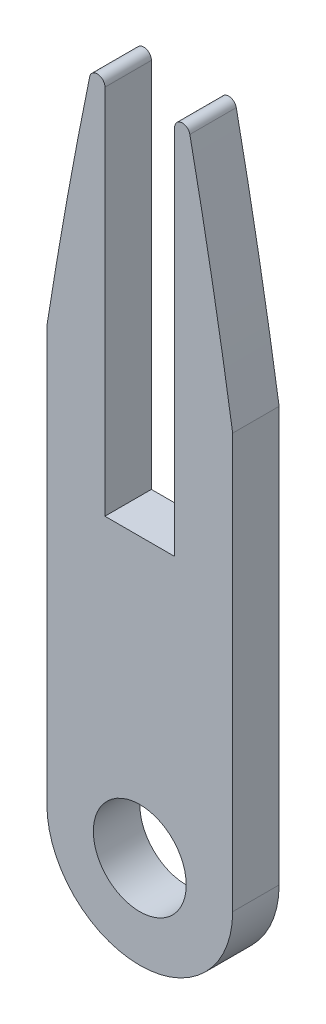
ISO-10303-21;
HEADER;
FILE_DESCRIPTION(('STEP AP214'),'2;1');
FILE_NAME('part.step','',(''),(''),'','','');
FILE_SCHEMA(('AUTOMOTIVE_DESIGN { 1 0 10303 214 1 1 1 1 }'));
ENDSEC;
DATA;
#1=APPLICATION_CONTEXT('core data for automotive mechanical design processes');
#2=APPLICATION_PROTOCOL_DEFINITION('international standard','automotive_design',2000,#1);
#3=PRODUCT_CONTEXT('',#1,'mechanical');
#4=PRODUCT('Part','Part','',(#3));
#5=PRODUCT_RELATED_PRODUCT_CATEGORY('part','',(#4));
#6=PRODUCT_DEFINITION_FORMATION('','',#4);
#7=PRODUCT_DEFINITION_CONTEXT('part definition',#1,'design');
#8=PRODUCT_DEFINITION('design','',#6,#7);
#9=PRODUCT_DEFINITION_SHAPE('','',#8);
#10=(LENGTH_UNIT() NAMED_UNIT(*) SI_UNIT(.MILLI.,.METRE.));
#11=(NAMED_UNIT(*) PLANE_ANGLE_UNIT() SI_UNIT($,.RADIAN.));
#12=(NAMED_UNIT(*) SI_UNIT($,.STERADIAN.) SOLID_ANGLE_UNIT());
#13=UNCERTAINTY_MEASURE_WITH_UNIT(LENGTH_MEASURE(1.E-05),#10,'distance_accuracy_value','');
#14=(GEOMETRIC_REPRESENTATION_CONTEXT(3) GLOBAL_UNCERTAINTY_ASSIGNED_CONTEXT((#13)) GLOBAL_UNIT_ASSIGNED_CONTEXT((#10,
#11,#12)) REPRESENTATION_CONTEXT('',''));
#15=CARTESIAN_POINT('',(0.,0.,0.));
#16=DIRECTION('',(0.,0.,1.));
#17=DIRECTION('',(1.,0.,0.));
#18=AXIS2_PLACEMENT_3D('',#15,#16,#17);
#19=CARTESIAN_POINT('',(-1327.35745312875,-97.269157480229,6.35));
#20=DIRECTION('',(0.,0.,-1.));
#21=DIRECTION('',(-1.,0.,0.));
#22=AXIS2_PLACEMENT_3D('',#19,#20,#21);
#23=CYLINDRICAL_SURFACE('',#22,1369.05400653331);
#24=CARTESIAN_POINT('',(-1327.35745312875,-97.269157480229,-6.35));
#25=DIRECTION('',(0.,0.,1.));
#26=DIRECTION('',(1.,0.,0.));
#27=AXIS2_PLACEMENT_3D('',#24,#25,#26);
#28=CIRCLE('',#27,1369.05400653331);
#29=CARTESIAN_POINT('',(13.6916282188116,178.223554259595,-6.35));
#30=VERTEX_POINT('',#29);
#31=CARTESIAN_POINT('',(25.4,113.339830479728,-6.35));
#32=VERTEX_POINT('',#31);
#33=EDGE_CURVE('E156',#30,#32,#28,.F.);
#34=ORIENTED_EDGE('',*,*,#33,.F.);
#35=DIRECTION('',(0.,0.,-1.));
#36=VECTOR('',#35,1.);
#37=CARTESIAN_POINT('',(13.6916282188116,178.223554259595,6.35));
#38=LINE('',#37,#36);
#39=CARTESIAN_POINT('',(13.6916282188116,178.223554259595,6.35));
#40=VERTEX_POINT('',#39);
#41=EDGE_CURVE('E11',#40,#30,#38,.T.);
#42=ORIENTED_EDGE('',*,*,#41,.F.);
#43=CARTESIAN_POINT('',(-1327.35745312875,-97.269157480229,6.35));
#44=DIRECTION('',(0.,0.,1.));
#45=DIRECTION('',(1.,0.,0.));
#46=AXIS2_PLACEMENT_3D('',#43,#44,#45);
#47=CIRCLE('',#46,1369.05400653331);
#48=CARTESIAN_POINT('',(25.4,113.339830479728,6.35));
#49=VERTEX_POINT('',#48);
#50=EDGE_CURVE('E250',#40,#49,#47,.F.);
#51=ORIENTED_EDGE('',*,*,#50,.T.);
#52=DIRECTION('',(0.,0.,-1.));
#53=VECTOR('',#52,1.);
#54=CARTESIAN_POINT('',(25.4,113.339830479728,6.35));
#55=LINE('',#54,#53);
#56=EDGE_CURVE('E105',#49,#32,#55,.T.);
#57=ORIENTED_EDGE('',*,*,#56,.T.);
#58=EDGE_LOOP('',(#34,#42,#51,#57));
#59=FACE_BOUND('',#58,.T.);
#60=ADVANCED_FACE('F42',(#59),#23,.T.);
#61=CARTESIAN_POINT('',(11.6298420933535,177.8,6.35));
#62=DIRECTION('',(0.,0.,-1.));
#63=DIRECTION('',(-1.,0.,0.));
#64=AXIS2_PLACEMENT_3D('',#61,#62,#63);
#65=CYLINDRICAL_SURFACE('',#64,2.10484209335346);
#66=CARTESIAN_POINT('',(11.6298420933535,177.8,-6.35));
#67=DIRECTION('',(0.,0.,1.));
#68=DIRECTION('',(1.,0.,0.));
#69=AXIS2_PLACEMENT_3D('',#66,#67,#68);
#70=CIRCLE('',#69,2.10484209335346);
#71=CARTESIAN_POINT('',(9.52500000000001,177.8,-6.35));
#72=VERTEX_POINT('',#71);
#73=EDGE_CURVE('E158',#72,#30,#70,.F.);
#74=ORIENTED_EDGE('',*,*,#73,.F.);
#75=DIRECTION('',(0.,0.,-1.));
#76=VECTOR('',#75,1.);
#77=CARTESIAN_POINT('',(9.52500000000001,177.8,6.35));
#78=LINE('',#77,#76);
#79=CARTESIAN_POINT('',(9.52500000000001,177.8,6.35));
#80=VERTEX_POINT('',#79);
#81=EDGE_CURVE('E52',#80,#72,#78,.T.);
#82=ORIENTED_EDGE('',*,*,#81,.F.);
#83=CARTESIAN_POINT('',(11.6298420933535,177.8,6.35));
#84=DIRECTION('',(0.,0.,1.));
#85=DIRECTION('',(1.,0.,0.));
#86=AXIS2_PLACEMENT_3D('',#83,#84,#85);
#87=CIRCLE('',#86,2.10484209335346);
#88=EDGE_CURVE('E202',#80,#40,#87,.F.);
#89=ORIENTED_EDGE('',*,*,#88,.T.);
#90=ORIENTED_EDGE('',*,*,#41,.T.);
#91=EDGE_LOOP('',(#74,#82,#89,#90));
#92=FACE_BOUND('',#91,.T.);
#93=ADVANCED_FACE('F204',(#92),#65,.T.);
#94=CARTESIAN_POINT('',(9.52499999999999,0.,6.35));
#95=DIRECTION('',(1.,0.,0.));
#96=DIRECTION('',(0.,1.,0.));
#97=AXIS2_PLACEMENT_3D('',#94,#95,#96);
#98=PLANE('',#97);
#99=DIRECTION('',(0.,-1.,0.));
#100=VECTOR('',#99,1.);
#101=CARTESIAN_POINT('',(9.52499999999999,0.,-6.35));
#102=LINE('',#101,#100);
#103=CARTESIAN_POINT('',(9.525,76.2,-6.35));
#104=VERTEX_POINT('',#103);
#105=EDGE_CURVE('E161',#72,#104,#102,.T.);
#106=ORIENTED_EDGE('',*,*,#105,.T.);
#107=DIRECTION('',(0.,0.,-1.));
#108=VECTOR('',#107,1.);
#109=CARTESIAN_POINT('',(9.525,76.2,6.35));
#110=LINE('',#109,#108);
#111=CARTESIAN_POINT('',(9.525,76.2,6.35));
#112=VERTEX_POINT('',#111);
#113=EDGE_CURVE('E192',#112,#104,#110,.T.);
#114=ORIENTED_EDGE('',*,*,#113,.F.);
#115=DIRECTION('',(0.,-1.,0.));
#116=VECTOR('',#115,1.);
#117=CARTESIAN_POINT('',(9.52499999999999,0.,6.35));
#118=LINE('',#117,#116);
#119=EDGE_CURVE('E197',#80,#112,#118,.T.);
#120=ORIENTED_EDGE('',*,*,#119,.F.);
#121=ORIENTED_EDGE('',*,*,#81,.T.);
#122=EDGE_LOOP('',(#106,#114,#120,#121));
#123=FACE_BOUND('',#122,.T.);
#124=ADVANCED_FACE('F193',(#123),#98,.F.);
#125=CARTESIAN_POINT('',(0.,76.2,6.35));
#126=DIRECTION('',(0.,1.,0.));
#127=DIRECTION('',(0.,0.,1.));
#128=AXIS2_PLACEMENT_3D('',#125,#126,#127);
#129=PLANE('',#128);
#130=DIRECTION('',(1.,0.,0.));
#131=VECTOR('',#130,1.);
#132=CARTESIAN_POINT('',(0.,76.2,-6.35));
#133=LINE('',#132,#131);
#134=CARTESIAN_POINT('',(-9.525,76.2,-6.35));
#135=VERTEX_POINT('',#134);
#136=EDGE_CURVE('E163',#135,#104,#133,.T.);
#137=ORIENTED_EDGE('',*,*,#136,.F.);
#138=DIRECTION('',(0.,0.,-1.));
#139=VECTOR('',#138,1.);
#140=CARTESIAN_POINT('',(-9.525,76.2,6.35));
#141=LINE('',#140,#139);
#142=CARTESIAN_POINT('',(-9.525,76.2,6.35));
#143=VERTEX_POINT('',#142);
#144=EDGE_CURVE('E186',#143,#135,#141,.T.);
#145=ORIENTED_EDGE('',*,*,#144,.F.);
#146=DIRECTION('',(1.,0.,0.));
#147=VECTOR('',#146,1.);
#148=CARTESIAN_POINT('',(0.,76.2,6.35));
#149=LINE('',#148,#147);
#150=EDGE_CURVE('E255',#143,#112,#149,.T.);
#151=ORIENTED_EDGE('',*,*,#150,.T.);
#152=ORIENTED_EDGE('',*,*,#113,.T.);
#153=EDGE_LOOP('',(#137,#145,#151,#152));
#154=FACE_BOUND('',#153,.T.);
#155=ADVANCED_FACE('F212',(#154),#129,.T.);
#156=CARTESIAN_POINT('',(-9.52499999999999,0.,6.35));
#157=DIRECTION('',(1.,0.,0.));
#158=DIRECTION('',(0.,1.,0.));
#159=AXIS2_PLACEMENT_3D('',#156,#157,#158);
#160=PLANE('',#159);
#161=DIRECTION('',(0.,-1.,0.));
#162=VECTOR('',#161,1.);
#163=CARTESIAN_POINT('',(-9.52499999999999,0.,-6.35));
#164=LINE('',#163,#162);
#165=CARTESIAN_POINT('',(-9.52500000000001,177.8,-6.35));
#166=VERTEX_POINT('',#165);
#167=EDGE_CURVE('E170',#166,#135,#164,.T.);
#168=ORIENTED_EDGE('',*,*,#167,.F.);
#169=DIRECTION('',(0.,0.,-1.));
#170=VECTOR('',#169,1.);
#171=CARTESIAN_POINT('',(-9.52500000000001,177.8,6.35));
#172=LINE('',#171,#170);
#173=CARTESIAN_POINT('',(-9.52500000000001,177.8,6.35));
#174=VERTEX_POINT('',#173);
#175=EDGE_CURVE('E190',#174,#166,#172,.T.);
#176=ORIENTED_EDGE('',*,*,#175,.F.);
#177=DIRECTION('',(0.,-1.,0.));
#178=VECTOR('',#177,1.);
#179=CARTESIAN_POINT('',(-9.52499999999999,0.,6.35));
#180=LINE('',#179,#178);
#181=EDGE_CURVE('E260',#174,#143,#180,.T.);
#182=ORIENTED_EDGE('',*,*,#181,.T.);
#183=ORIENTED_EDGE('',*,*,#144,.T.);
#184=EDGE_LOOP('',(#168,#176,#182,#183));
#185=FACE_BOUND('',#184,.T.);
#186=ADVANCED_FACE('F220',(#185),#160,.T.);
#187=CARTESIAN_POINT('',(-11.6298420933534,177.8,6.35));
#188=DIRECTION('',(0.,0.,-1.));
#189=DIRECTION('',(-1.,0.,0.));
#190=AXIS2_PLACEMENT_3D('',#187,#188,#189);
#191=CYLINDRICAL_SURFACE('',#190,2.10484209335331);
#192=CARTESIAN_POINT('',(-11.6298420933534,177.8,-6.35));
#193=DIRECTION('',(0.,0.,1.));
#194=DIRECTION('',(1.,0.,0.));
#195=AXIS2_PLACEMENT_3D('',#192,#193,#194);
#196=CIRCLE('',#195,2.10484209335331);
#197=CARTESIAN_POINT('',(-13.6916282188115,178.223554259594,-6.35));
#198=VERTEX_POINT('',#197);
#199=EDGE_CURVE('E168',#166,#198,#196,.T.);
#200=ORIENTED_EDGE('',*,*,#199,.T.);
#201=DIRECTION('',(0.,0.,-1.));
#202=VECTOR('',#201,1.);
#203=CARTESIAN_POINT('',(-13.6916282188115,178.223554259594,6.35));
#204=LINE('',#203,#202);
#205=CARTESIAN_POINT('',(-13.6916282188115,178.223554259594,6.35));
#206=VERTEX_POINT('',#205);
#207=EDGE_CURVE('E184',#206,#198,#204,.T.);
#208=ORIENTED_EDGE('',*,*,#207,.F.);
#209=CARTESIAN_POINT('',(-11.6298420933534,177.8,6.35));
#210=DIRECTION('',(0.,0.,1.));
#211=DIRECTION('',(1.,0.,0.));
#212=AXIS2_PLACEMENT_3D('',#209,#210,#211);
#213=CIRCLE('',#212,2.10484209335331);
#214=EDGE_CURVE('E146',#174,#206,#213,.T.);
#215=ORIENTED_EDGE('',*,*,#214,.F.);
#216=ORIENTED_EDGE('',*,*,#175,.T.);
#217=EDGE_LOOP('',(#200,#208,#215,#216));
#218=FACE_BOUND('',#217,.T.);
#219=ADVANCED_FACE('F222',(#218),#191,.T.);
#220=CARTESIAN_POINT('',(1327.35745312875,-97.2691574802253,6.35));
#221=DIRECTION('',(0.,0.,-1.));
#222=DIRECTION('',(-1.,0.,0.));
#223=AXIS2_PLACEMENT_3D('',#220,#221,#222);
#224=CYLINDRICAL_SURFACE('',#223,1369.05400653331);
#225=CARTESIAN_POINT('',(1327.35745312875,-97.2691574802253,-6.35));
#226=DIRECTION('',(0.,0.,1.));
#227=DIRECTION('',(1.,0.,0.));
#228=AXIS2_PLACEMENT_3D('',#225,#226,#227);
#229=CIRCLE('',#228,1369.05400653331);
#230=CARTESIAN_POINT('',(-25.4,113.339830479728,-6.35));
#231=VERTEX_POINT('',#230);
#232=EDGE_CURVE('E174',#198,#231,#229,.T.);
#233=ORIENTED_EDGE('',*,*,#232,.T.);
#234=DIRECTION('',(0.,0.,-1.));
#235=VECTOR('',#234,1.);
#236=CARTESIAN_POINT('',(-25.4,113.339830479728,6.35));
#237=LINE('',#236,#235);
#238=CARTESIAN_POINT('',(-25.4,113.339830479728,6.35));
#239=VERTEX_POINT('',#238);
#240=EDGE_CURVE('E137',#239,#231,#237,.T.);
#241=ORIENTED_EDGE('',*,*,#240,.F.);
#242=CARTESIAN_POINT('',(1327.35745312875,-97.2691574802253,6.35));
#243=DIRECTION('',(0.,0.,1.));
#244=DIRECTION('',(1.,0.,0.));
#245=AXIS2_PLACEMENT_3D('',#242,#243,#244);
#246=CIRCLE('',#245,1369.05400653331);
#247=EDGE_CURVE('E144',#206,#239,#246,.T.);
#248=ORIENTED_EDGE('',*,*,#247,.F.);
#249=ORIENTED_EDGE('',*,*,#207,.T.);
#250=EDGE_LOOP('',(#233,#241,#248,#249));
#251=FACE_BOUND('',#250,.T.);
#252=ADVANCED_FACE('F223',(#251),#224,.T.);
#253=CARTESIAN_POINT('',(-25.4,0.,6.35));
#254=DIRECTION('',(-1.,0.,0.));
#255=DIRECTION('',(0.,-1.,0.));
#256=AXIS2_PLACEMENT_3D('',#253,#254,#255);
#257=PLANE('',#256);
#258=DIRECTION('',(0.,1.,0.));
#259=VECTOR('',#258,1.);
#260=CARTESIAN_POINT('',(-25.4,0.,-6.35));
#261=LINE('',#260,#259);
#262=CARTESIAN_POINT('',(-25.4,0.,-6.35));
#263=VERTEX_POINT('',#262);
#264=EDGE_CURVE('E134',#263,#231,#261,.T.);
#265=ORIENTED_EDGE('',*,*,#264,.F.);
#266=DIRECTION('',(0.,0.,-1.));
#267=VECTOR('',#266,1.);
#268=CARTESIAN_POINT('',(-25.4,0.,6.35));
#269=LINE('',#268,#267);
#270=CARTESIAN_POINT('',(-25.4,0.,6.35));
#271=VERTEX_POINT('',#270);
#272=EDGE_CURVE('E130',#271,#263,#269,.T.);
#273=ORIENTED_EDGE('',*,*,#272,.F.);
#274=DIRECTION('',(0.,1.,0.));
#275=VECTOR('',#274,1.);
#276=CARTESIAN_POINT('',(-25.4,0.,6.35));
#277=LINE('',#276,#275);
#278=EDGE_CURVE('E132',#271,#239,#277,.T.);
#279=ORIENTED_EDGE('',*,*,#278,.T.);
#280=ORIENTED_EDGE('',*,*,#240,.T.);
#281=EDGE_LOOP('',(#265,#273,#279,#280));
#282=FACE_BOUND('',#281,.T.);
#283=ADVANCED_FACE('F129',(#282),#257,.T.);
#284=CARTESIAN_POINT('',(0.,0.,6.35));
#285=DIRECTION('',(0.,0.,-1.));
#286=DIRECTION('',(-1.,0.,0.));
#287=AXIS2_PLACEMENT_3D('',#284,#285,#286);
#288=CYLINDRICAL_SURFACE('',#287,25.4);
#289=CARTESIAN_POINT('',(0.,0.,-6.35));
#290=DIRECTION('',(0.,0.,1.));
#291=DIRECTION('',(1.,0.,0.));
#292=AXIS2_PLACEMENT_3D('',#289,#290,#291);
#293=CIRCLE('',#292,25.4);
#294=CARTESIAN_POINT('',(25.4,0.,-6.35));
#295=VERTEX_POINT('',#294);
#296=EDGE_CURVE('E180',#263,#295,#293,.T.);
#297=ORIENTED_EDGE('',*,*,#296,.T.);
#298=DIRECTION('',(0.,0.,-1.));
#299=VECTOR('',#298,1.);
#300=CARTESIAN_POINT('',(25.4,0.,6.35));
#301=LINE('',#300,#299);
#302=CARTESIAN_POINT('',(25.4,0.,6.35));
#303=VERTEX_POINT('',#302);
#304=EDGE_CURVE('E139',#303,#295,#301,.T.);
#305=ORIENTED_EDGE('',*,*,#304,.F.);
#306=CARTESIAN_POINT('',(0.,0.,6.35));
#307=DIRECTION('',(0.,0.,1.));
#308=DIRECTION('',(1.,0.,0.));
#309=AXIS2_PLACEMENT_3D('',#306,#307,#308);
#310=CIRCLE('',#309,25.4);
#311=EDGE_CURVE('E138',#271,#303,#310,.T.);
#312=ORIENTED_EDGE('',*,*,#311,.F.);
#313=ORIENTED_EDGE('',*,*,#272,.T.);
#314=EDGE_LOOP('',(#297,#305,#312,#313));
#315=FACE_BOUND('',#314,.T.);
#316=ADVANCED_FACE('F143',(#315),#288,.T.);
#317=CARTESIAN_POINT('',(0.,0.,6.35));
#318=DIRECTION('',(0.,0.,-1.));
#319=DIRECTION('',(-1.,0.,0.));
#320=AXIS2_PLACEMENT_3D('',#317,#318,#319);
#321=CYLINDRICAL_SURFACE('',#320,12.7);
#322=CARTESIAN_POINT('',(0.,0.,6.35));
#323=DIRECTION('',(0.,0.,1.));
#324=DIRECTION('',(1.,0.,0.));
#325=AXIS2_PLACEMENT_3D('',#322,#323,#324);
#326=CIRCLE('',#325,12.7);
#327=CARTESIAN_POINT('',(12.7,0.,6.35));
#328=VERTEX_POINT('',#327);
#329=EDGE_CURVE('E179',#328,#328,#326,.T.);
#330=ORIENTED_EDGE('',*,*,#329,.T.);
#331=EDGE_LOOP('',(#330));
#332=FACE_BOUND('',#331,.T.);
#333=CARTESIAN_POINT('',(0.,0.,-6.35));
#334=DIRECTION('',(0.,0.,1.));
#335=DIRECTION('',(1.,0.,0.));
#336=AXIS2_PLACEMENT_3D('',#333,#334,#335);
#337=CIRCLE('',#336,12.7);
#338=CARTESIAN_POINT('',(12.7,0.,-6.35));
#339=VERTEX_POINT('',#338);
#340=EDGE_CURVE('E153',#339,#339,#337,.T.);
#341=ORIENTED_EDGE('',*,*,#340,.F.);
#342=EDGE_LOOP('',(#341));
#343=FACE_BOUND('',#342,.T.);
#344=ADVANCED_FACE('F46',(#332,#343),#321,.F.);
#345=CARTESIAN_POINT('',(25.4,0.,6.35));
#346=DIRECTION('',(-1.,0.,0.));
#347=DIRECTION('',(0.,-1.,0.));
#348=AXIS2_PLACEMENT_3D('',#345,#346,#347);
#349=PLANE('',#348);
#350=DIRECTION('',(0.,1.,0.));
#351=VECTOR('',#350,1.);
#352=CARTESIAN_POINT('',(25.4,0.,-6.35));
#353=LINE('',#352,#351);
#354=EDGE_CURVE('E92',#295,#32,#353,.T.);
#355=ORIENTED_EDGE('',*,*,#354,.T.);
#356=ORIENTED_EDGE('',*,*,#56,.F.);
#357=DIRECTION('',(0.,1.,0.));
#358=VECTOR('',#357,1.);
#359=CARTESIAN_POINT('',(25.4,0.,6.35));
#360=LINE('',#359,#358);
#361=EDGE_CURVE('E62',#303,#49,#360,.T.);
#362=ORIENTED_EDGE('',*,*,#361,.F.);
#363=ORIENTED_EDGE('',*,*,#304,.T.);
#364=EDGE_LOOP('',(#355,#356,#362,#363));
#365=FACE_BOUND('',#364,.T.);
#366=ADVANCED_FACE('F232',(#365),#349,.F.);
#367=CARTESIAN_POINT('',(0.,0.,6.35));
#368=DIRECTION('',(0.,0.,1.));
#369=DIRECTION('',(1.,0.,0.));
#370=AXIS2_PLACEMENT_3D('',#367,#368,#369);
#371=PLANE('',#370);
#372=ORIENTED_EDGE('',*,*,#329,.F.);
#373=EDGE_LOOP('',(#372));
#374=FACE_BOUND('',#373,.T.);
#375=ORIENTED_EDGE('',*,*,#50,.F.);
#376=ORIENTED_EDGE('',*,*,#88,.F.);
#377=ORIENTED_EDGE('',*,*,#119,.T.);
#378=ORIENTED_EDGE('',*,*,#150,.F.);
#379=ORIENTED_EDGE('',*,*,#181,.F.);
#380=ORIENTED_EDGE('',*,*,#214,.T.);
#381=ORIENTED_EDGE('',*,*,#247,.T.);
#382=ORIENTED_EDGE('',*,*,#278,.F.);
#383=ORIENTED_EDGE('',*,*,#311,.T.);
#384=ORIENTED_EDGE('',*,*,#361,.T.);
#385=EDGE_LOOP('',(#375,#376,#377,#378,#379,#380,#381,#382,#383,#384));
#386=FACE_BOUND('',#385,.T.);
#387=ADVANCED_FACE('F141',(#374,#386),#371,.T.);
#388=CARTESIAN_POINT('',(0.,0.,-6.35));
#389=DIRECTION('',(0.,0.,1.));
#390=DIRECTION('',(1.,0.,0.));
#391=AXIS2_PLACEMENT_3D('',#388,#389,#390);
#392=PLANE('',#391);
#393=ORIENTED_EDGE('',*,*,#340,.T.);
#394=EDGE_LOOP('',(#393));
#395=FACE_BOUND('',#394,.T.);
#396=ORIENTED_EDGE('',*,*,#33,.T.);
#397=ORIENTED_EDGE('',*,*,#354,.F.);
#398=ORIENTED_EDGE('',*,*,#296,.F.);
#399=ORIENTED_EDGE('',*,*,#264,.T.);
#400=ORIENTED_EDGE('',*,*,#232,.F.);
#401=ORIENTED_EDGE('',*,*,#199,.F.);
#402=ORIENTED_EDGE('',*,*,#167,.T.);
#403=ORIENTED_EDGE('',*,*,#136,.T.);
#404=ORIENTED_EDGE('',*,*,#105,.F.);
#405=ORIENTED_EDGE('',*,*,#73,.T.);
#406=EDGE_LOOP('',(#396,#397,#398,#399,#400,#401,#402,#403,#404,#405));
#407=FACE_BOUND('',#406,.T.);
#408=ADVANCED_FACE('F205',(#395,#407),#392,.F.);
#409=CLOSED_SHELL('',(#60,#93,#124,#155,#186,#219,#252,#283,#316,#344,#366,#387,#408));
#410=MANIFOLD_SOLID_BREP('B2',#409);
#411=ADVANCED_BREP_SHAPE_REPRESENTATION('',(#18,#410),#14);
#412=SHAPE_DEFINITION_REPRESENTATION(#9,#411);
ENDSEC;
END-ISO-10303-21;
